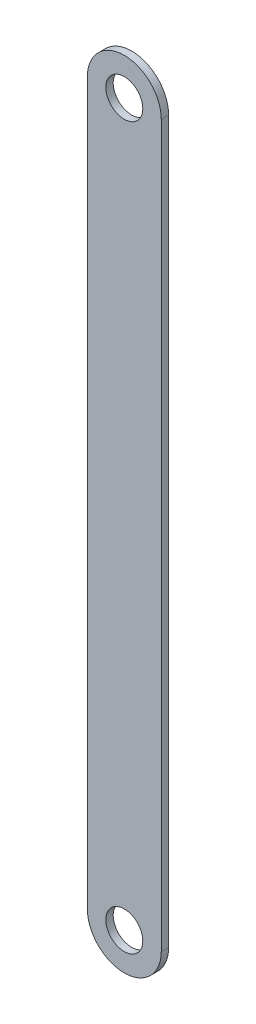
ISO-10303-21;
HEADER;
FILE_DESCRIPTION(('STEP AP214'),'2;1');
FILE_NAME('part.step','',(''),(''),'','','');
FILE_SCHEMA(('AUTOMOTIVE_DESIGN { 1 0 10303 214 1 1 1 1 }'));
ENDSEC;
DATA;
#1=APPLICATION_CONTEXT('core data for automotive mechanical design processes');
#2=APPLICATION_PROTOCOL_DEFINITION('international standard','automotive_design',2000,#1);
#3=PRODUCT_CONTEXT('',#1,'mechanical');
#4=PRODUCT('Part','Part','',(#3));
#5=PRODUCT_RELATED_PRODUCT_CATEGORY('part','',(#4));
#6=PRODUCT_DEFINITION_FORMATION('','',#4);
#7=PRODUCT_DEFINITION_CONTEXT('part definition',#1,'design');
#8=PRODUCT_DEFINITION('design','',#6,#7);
#9=PRODUCT_DEFINITION_SHAPE('','',#8);
#10=(LENGTH_UNIT() NAMED_UNIT(*) SI_UNIT(.MILLI.,.METRE.));
#11=(NAMED_UNIT(*) PLANE_ANGLE_UNIT() SI_UNIT($,.RADIAN.));
#12=(NAMED_UNIT(*) SI_UNIT($,.STERADIAN.) SOLID_ANGLE_UNIT());
#13=UNCERTAINTY_MEASURE_WITH_UNIT(LENGTH_MEASURE(1.E-05),#10,'distance_accuracy_value','');
#14=(GEOMETRIC_REPRESENTATION_CONTEXT(3) GLOBAL_UNCERTAINTY_ASSIGNED_CONTEXT((#13)) GLOBAL_UNIT_ASSIGNED_CONTEXT((#10,
#11,#12)) REPRESENTATION_CONTEXT('',''));
#15=CARTESIAN_POINT('',(0.,0.,0.));
#16=DIRECTION('',(0.,0.,1.));
#17=DIRECTION('',(1.,0.,0.));
#18=AXIS2_PLACEMENT_3D('',#15,#16,#17);
#19=CARTESIAN_POINT('',(0.,97.5,1.));
#20=DIRECTION('',(0.,0.,1.));
#21=DIRECTION('',(1.,0.,0.));
#22=AXIS2_PLACEMENT_3D('',#19,#20,#21);
#23=PLANE('',#22);
#24=CARTESIAN_POINT('',(0.,0.,1.));
#25=DIRECTION('',(0.,0.,1.));
#26=DIRECTION('',(1.,0.,0.));
#27=AXIS2_PLACEMENT_3D('',#24,#25,#26);
#28=CIRCLE('',#27,2.5);
#29=CARTESIAN_POINT('',(2.5,0.,1.));
#30=VERTEX_POINT('',#29);
#31=EDGE_CURVE('E102',#30,#30,#28,.T.);
#32=ORIENTED_EDGE('',*,*,#31,.F.);
#33=EDGE_LOOP('',(#32));
#34=FACE_BOUND('',#33,.T.);
#35=CARTESIAN_POINT('',(0.,97.5,1.));
#36=DIRECTION('',(0.,0.,1.));
#37=DIRECTION('',(1.,0.,0.));
#38=AXIS2_PLACEMENT_3D('',#35,#36,#37);
#39=CIRCLE('',#38,5.00000000000001);
#40=CARTESIAN_POINT('',(5.00000000000001,97.5,1.));
#41=VERTEX_POINT('',#40);
#42=CARTESIAN_POINT('',(-5.00000000000001,97.5,1.));
#43=VERTEX_POINT('',#42);
#44=EDGE_CURVE('E87',#41,#43,#39,.T.);
#45=ORIENTED_EDGE('',*,*,#44,.T.);
#46=DIRECTION('',(0.,-1.,0.));
#47=VECTOR('',#46,1.);
#48=CARTESIAN_POINT('',(-5.00000000000001,97.5,1.));
#49=LINE('',#48,#47);
#50=CARTESIAN_POINT('',(-5.,0.,1.));
#51=VERTEX_POINT('',#50);
#52=EDGE_CURVE('E82',#43,#51,#49,.T.);
#53=ORIENTED_EDGE('',*,*,#52,.T.);
#54=CARTESIAN_POINT('',(0.,0.,1.));
#55=DIRECTION('',(0.,0.,1.));
#56=DIRECTION('',(1.,0.,0.));
#57=AXIS2_PLACEMENT_3D('',#54,#55,#56);
#58=CIRCLE('',#57,5.);
#59=CARTESIAN_POINT('',(5.,0.,1.));
#60=VERTEX_POINT('',#59);
#61=EDGE_CURVE('E85',#51,#60,#58,.T.);
#62=ORIENTED_EDGE('',*,*,#61,.T.);
#63=DIRECTION('',(0.,1.,0.));
#64=VECTOR('',#63,1.);
#65=CARTESIAN_POINT('',(5.00000000000001,97.5,1.));
#66=LINE('',#65,#64);
#67=EDGE_CURVE('E52',#60,#41,#66,.T.);
#68=ORIENTED_EDGE('',*,*,#67,.T.);
#69=EDGE_LOOP('',(#45,#53,#62,#68));
#70=FACE_BOUND('',#69,.T.);
#71=CARTESIAN_POINT('',(0.,97.5,1.));
#72=DIRECTION('',(0.,0.,1.));
#73=DIRECTION('',(1.,0.,0.));
#74=AXIS2_PLACEMENT_3D('',#71,#72,#73);
#75=CIRCLE('',#74,2.5);
#76=CARTESIAN_POINT('',(2.5,97.5,1.));
#77=VERTEX_POINT('',#76);
#78=EDGE_CURVE('E117',#77,#77,#75,.T.);
#79=ORIENTED_EDGE('',*,*,#78,.F.);
#80=EDGE_LOOP('',(#79));
#81=FACE_BOUND('',#80,.T.);
#82=ADVANCED_FACE('F35',(#34,#70,#81),#23,.T.);
#83=CARTESIAN_POINT('',(0.,97.5,0.));
#84=DIRECTION('',(0.,0.,1.));
#85=DIRECTION('',(1.,0.,0.));
#86=AXIS2_PLACEMENT_3D('',#83,#84,#85);
#87=PLANE('',#86);
#88=CARTESIAN_POINT('',(0.,97.5,0.));
#89=DIRECTION('',(0.,0.,1.));
#90=DIRECTION('',(1.,0.,0.));
#91=AXIS2_PLACEMENT_3D('',#88,#89,#90);
#92=CIRCLE('',#91,5.00000000000001);
#93=CARTESIAN_POINT('',(5.00000000000001,97.5,0.));
#94=VERTEX_POINT('',#93);
#95=CARTESIAN_POINT('',(-5.00000000000001,97.5,0.));
#96=VERTEX_POINT('',#95);
#97=EDGE_CURVE('E99',#94,#96,#92,.T.);
#98=ORIENTED_EDGE('',*,*,#97,.F.);
#99=DIRECTION('',(0.,1.,0.));
#100=VECTOR('',#99,1.);
#101=CARTESIAN_POINT('',(5.00000000000001,97.5,0.));
#102=LINE('',#101,#100);
#103=CARTESIAN_POINT('',(5.,0.,0.));
#104=VERTEX_POINT('',#103);
#105=EDGE_CURVE('E75',#104,#94,#102,.T.);
#106=ORIENTED_EDGE('',*,*,#105,.F.);
#107=CARTESIAN_POINT('',(0.,0.,0.));
#108=DIRECTION('',(0.,0.,1.));
#109=DIRECTION('',(1.,0.,0.));
#110=AXIS2_PLACEMENT_3D('',#107,#108,#109);
#111=CIRCLE('',#110,5.);
#112=CARTESIAN_POINT('',(-5.,0.,0.));
#113=VERTEX_POINT('',#112);
#114=EDGE_CURVE('E69',#113,#104,#111,.T.);
#115=ORIENTED_EDGE('',*,*,#114,.F.);
#116=DIRECTION('',(0.,-1.,0.));
#117=VECTOR('',#116,1.);
#118=CARTESIAN_POINT('',(-5.00000000000001,97.5,0.));
#119=LINE('',#118,#117);
#120=EDGE_CURVE('E91',#96,#113,#119,.T.);
#121=ORIENTED_EDGE('',*,*,#120,.F.);
#122=EDGE_LOOP('',(#98,#106,#115,#121));
#123=FACE_BOUND('',#122,.T.);
#124=CARTESIAN_POINT('',(0.,0.,0.));
#125=DIRECTION('',(0.,0.,1.));
#126=DIRECTION('',(1.,0.,0.));
#127=AXIS2_PLACEMENT_3D('',#124,#125,#126);
#128=CIRCLE('',#127,2.5);
#129=CARTESIAN_POINT('',(2.5,0.,0.));
#130=VERTEX_POINT('',#129);
#131=EDGE_CURVE('E114',#130,#130,#128,.T.);
#132=ORIENTED_EDGE('',*,*,#131,.T.);
#133=EDGE_LOOP('',(#132));
#134=FACE_BOUND('',#133,.T.);
#135=CARTESIAN_POINT('',(0.,97.5,0.));
#136=DIRECTION('',(0.,0.,1.));
#137=DIRECTION('',(1.,0.,0.));
#138=AXIS2_PLACEMENT_3D('',#135,#136,#137);
#139=CIRCLE('',#138,2.5);
#140=CARTESIAN_POINT('',(2.5,97.5,0.));
#141=VERTEX_POINT('',#140);
#142=EDGE_CURVE('E120',#141,#141,#139,.T.);
#143=ORIENTED_EDGE('',*,*,#142,.T.);
#144=EDGE_LOOP('',(#143));
#145=FACE_BOUND('',#144,.T.);
#146=ADVANCED_FACE('F110',(#123,#134,#145),#87,.F.);
#147=CARTESIAN_POINT('',(0.,97.5,1.));
#148=DIRECTION('',(0.,0.,-1.));
#149=DIRECTION('',(-1.,0.,0.));
#150=AXIS2_PLACEMENT_3D('',#147,#148,#149);
#151=CYLINDRICAL_SURFACE('',#150,5.00000000000001);
#152=ORIENTED_EDGE('',*,*,#97,.T.);
#153=DIRECTION('',(0.,0.,-1.));
#154=VECTOR('',#153,1.);
#155=CARTESIAN_POINT('',(-5.00000000000001,97.5,1.));
#156=LINE('',#155,#154);
#157=EDGE_CURVE('E11',#43,#96,#156,.T.);
#158=ORIENTED_EDGE('',*,*,#157,.F.);
#159=ORIENTED_EDGE('',*,*,#44,.F.);
#160=DIRECTION('',(0.,0.,-1.));
#161=VECTOR('',#160,1.);
#162=CARTESIAN_POINT('',(5.00000000000001,97.5,1.));
#163=LINE('',#162,#161);
#164=EDGE_CURVE('E95',#41,#94,#163,.T.);
#165=ORIENTED_EDGE('',*,*,#164,.T.);
#166=EDGE_LOOP('',(#152,#158,#159,#165));
#167=FACE_BOUND('',#166,.T.);
#168=ADVANCED_FACE('F37',(#167),#151,.T.);
#169=CARTESIAN_POINT('',(-5.00000000000001,97.5,1.));
#170=DIRECTION('',(1.,0.,0.));
#171=DIRECTION('',(0.,1.,0.));
#172=AXIS2_PLACEMENT_3D('',#169,#170,#171);
#173=PLANE('',#172);
#174=ORIENTED_EDGE('',*,*,#120,.T.);
#175=DIRECTION('',(0.,0.,-1.));
#176=VECTOR('',#175,1.);
#177=CARTESIAN_POINT('',(-5.,0.,1.));
#178=LINE('',#177,#176);
#179=EDGE_CURVE('E44',#51,#113,#178,.T.);
#180=ORIENTED_EDGE('',*,*,#179,.F.);
#181=ORIENTED_EDGE('',*,*,#52,.F.);
#182=ORIENTED_EDGE('',*,*,#157,.T.);
#183=EDGE_LOOP('',(#174,#180,#181,#182));
#184=FACE_BOUND('',#183,.T.);
#185=ADVANCED_FACE('F90',(#184),#173,.F.);
#186=CARTESIAN_POINT('',(0.,0.,1.));
#187=DIRECTION('',(0.,0.,-1.));
#188=DIRECTION('',(-1.,0.,0.));
#189=AXIS2_PLACEMENT_3D('',#186,#187,#188);
#190=CYLINDRICAL_SURFACE('',#189,5.);
#191=ORIENTED_EDGE('',*,*,#114,.T.);
#192=DIRECTION('',(0.,0.,-1.));
#193=VECTOR('',#192,1.);
#194=CARTESIAN_POINT('',(5.,0.,1.));
#195=LINE('',#194,#193);
#196=EDGE_CURVE('E92',#60,#104,#195,.T.);
#197=ORIENTED_EDGE('',*,*,#196,.F.);
#198=ORIENTED_EDGE('',*,*,#61,.F.);
#199=ORIENTED_EDGE('',*,*,#179,.T.);
#200=EDGE_LOOP('',(#191,#197,#198,#199));
#201=FACE_BOUND('',#200,.T.);
#202=ADVANCED_FACE('F93',(#201),#190,.T.);
#203=CARTESIAN_POINT('',(5.00000000000001,97.5,1.));
#204=DIRECTION('',(-1.,0.,0.));
#205=DIRECTION('',(0.,-1.,0.));
#206=AXIS2_PLACEMENT_3D('',#203,#204,#205);
#207=PLANE('',#206);
#208=ORIENTED_EDGE('',*,*,#105,.T.);
#209=ORIENTED_EDGE('',*,*,#164,.F.);
#210=ORIENTED_EDGE('',*,*,#67,.F.);
#211=ORIENTED_EDGE('',*,*,#196,.T.);
#212=EDGE_LOOP('',(#208,#209,#210,#211));
#213=FACE_BOUND('',#212,.T.);
#214=ADVANCED_FACE('F107',(#213),#207,.F.);
#215=CARTESIAN_POINT('',(0.,0.,1.));
#216=DIRECTION('',(0.,0.,-1.));
#217=DIRECTION('',(-1.,0.,0.));
#218=AXIS2_PLACEMENT_3D('',#215,#216,#217);
#219=CYLINDRICAL_SURFACE('',#218,2.5);
#220=ORIENTED_EDGE('',*,*,#31,.T.);
#221=EDGE_LOOP('',(#220));
#222=FACE_BOUND('',#221,.T.);
#223=ORIENTED_EDGE('',*,*,#131,.F.);
#224=EDGE_LOOP('',(#223));
#225=FACE_BOUND('',#224,.T.);
#226=ADVANCED_FACE('F137',(#222,#225),#219,.F.);
#227=CARTESIAN_POINT('',(0.,97.5,1.));
#228=DIRECTION('',(0.,0.,-1.));
#229=DIRECTION('',(-1.,0.,0.));
#230=AXIS2_PLACEMENT_3D('',#227,#228,#229);
#231=CYLINDRICAL_SURFACE('',#230,2.5);
#232=ORIENTED_EDGE('',*,*,#78,.T.);
#233=EDGE_LOOP('',(#232));
#234=FACE_BOUND('',#233,.T.);
#235=ORIENTED_EDGE('',*,*,#142,.F.);
#236=EDGE_LOOP('',(#235));
#237=FACE_BOUND('',#236,.T.);
#238=ADVANCED_FACE('F126',(#234,#237),#231,.F.);
#239=CLOSED_SHELL('',(#82,#146,#168,#185,#202,#214,#226,#238));
#240=MANIFOLD_SOLID_BREP('B2',#239);
#241=ADVANCED_BREP_SHAPE_REPRESENTATION('',(#18,#240),#14);
#242=SHAPE_DEFINITION_REPRESENTATION(#9,#241);
ENDSEC;
END-ISO-10303-21;
